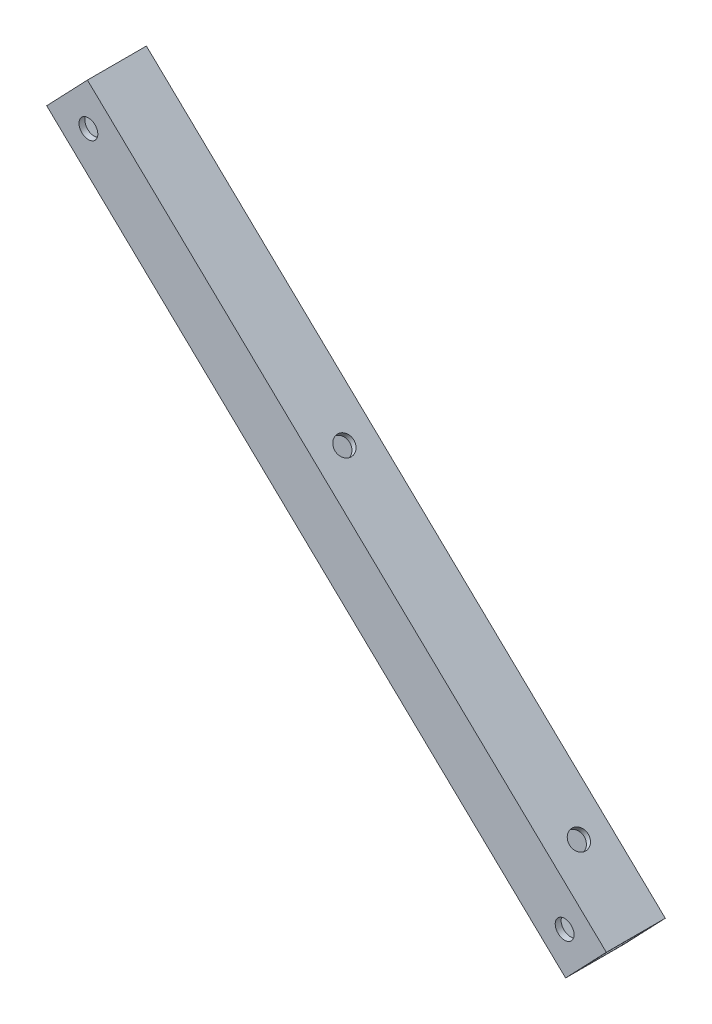
ISO-10303-21;
HEADER;
FILE_DESCRIPTION(('STEP AP214'),'2;1');
FILE_NAME('part.step','',(''),(''),'','','');
FILE_SCHEMA(('AUTOMOTIVE_DESIGN { 1 0 10303 214 1 1 1 1 }'));
ENDSEC;
DATA;
#1=APPLICATION_CONTEXT('core data for automotive mechanical design processes');
#2=APPLICATION_PROTOCOL_DEFINITION('international standard','automotive_design',2000,#1);
#3=PRODUCT_CONTEXT('',#1,'mechanical');
#4=PRODUCT('Part','Part','',(#3));
#5=PRODUCT_RELATED_PRODUCT_CATEGORY('part','',(#4));
#6=PRODUCT_DEFINITION_FORMATION('','',#4);
#7=PRODUCT_DEFINITION_CONTEXT('part definition',#1,'design');
#8=PRODUCT_DEFINITION('design','',#6,#7);
#9=PRODUCT_DEFINITION_SHAPE('','',#8);
#10=(LENGTH_UNIT() NAMED_UNIT(*) SI_UNIT(.MILLI.,.METRE.));
#11=(NAMED_UNIT(*) PLANE_ANGLE_UNIT() SI_UNIT($,.RADIAN.));
#12=(NAMED_UNIT(*) SI_UNIT($,.STERADIAN.) SOLID_ANGLE_UNIT());
#13=UNCERTAINTY_MEASURE_WITH_UNIT(LENGTH_MEASURE(1.E-05),#10,'distance_accuracy_value','');
#14=(GEOMETRIC_REPRESENTATION_CONTEXT(3) GLOBAL_UNCERTAINTY_ASSIGNED_CONTEXT((#13)) GLOBAL_UNIT_ASSIGNED_CONTEXT((#10,
#11,#12)) REPRESENTATION_CONTEXT('',''));
#15=CARTESIAN_POINT('',(0.,0.,0.));
#16=DIRECTION('',(0.,0.,1.));
#17=DIRECTION('',(1.,0.,0.));
#18=AXIS2_PLACEMENT_3D('',#15,#16,#17);
#19=CARTESIAN_POINT('',(-3.77609817293488,84.2848181798707,10.));
#20=DIRECTION('',(0.,0.,-1.));
#21=DIRECTION('',(-1.,0.,0.));
#22=AXIS2_PLACEMENT_3D('',#19,#20,#21);
#23=CYLINDRICAL_SURFACE('',#22,1.6);
#24=CARTESIAN_POINT('',(-3.77609817293488,84.2848181798707,9.));
#25=DIRECTION('',(0.,0.,1.));
#26=DIRECTION('',(1.,0.,0.));
#27=AXIS2_PLACEMENT_3D('',#24,#25,#26);
#28=CIRCLE('',#27,1.6);
#29=CARTESIAN_POINT('',(-2.17609817293488,84.2848181798707,9.));
#30=VERTEX_POINT('',#29);
#31=EDGE_CURVE('E136',#30,#30,#28,.T.);
#32=ORIENTED_EDGE('',*,*,#31,.F.);
#33=EDGE_LOOP('',(#32));
#34=FACE_BOUND('',#33,.T.);
#35=CARTESIAN_POINT('',(-3.77609817293488,84.2848181798707,10.));
#36=DIRECTION('',(0.,0.,1.));
#37=DIRECTION('',(1.,0.,0.));
#38=AXIS2_PLACEMENT_3D('',#35,#36,#37);
#39=CIRCLE('',#38,1.6);
#40=CARTESIAN_POINT('',(-2.17609817293488,84.2848181798707,10.));
#41=VERTEX_POINT('',#40);
#42=EDGE_CURVE('E146',#41,#41,#39,.T.);
#43=ORIENTED_EDGE('',*,*,#42,.T.);
#44=EDGE_LOOP('',(#43));
#45=FACE_BOUND('',#44,.T.);
#46=ADVANCED_FACE('F35',(#34,#45),#23,.F.);
#47=CARTESIAN_POINT('',(76.990408140841,7.09173909976924,10.));
#48=DIRECTION('',(0.,0.,-1.));
#49=DIRECTION('',(-1.,0.,0.));
#50=AXIS2_PLACEMENT_3D('',#47,#48,#49);
#51=CYLINDRICAL_SURFACE('',#50,1.60000000000001);
#52=CARTESIAN_POINT('',(76.990408140841,7.09173909976924,9.));
#53=DIRECTION('',(0.,0.,1.));
#54=DIRECTION('',(1.,0.,0.));
#55=AXIS2_PLACEMENT_3D('',#52,#53,#54);
#56=CIRCLE('',#55,1.60000000000001);
#57=CARTESIAN_POINT('',(78.590408140841,7.09173909976924,9.));
#58=VERTEX_POINT('',#57);
#59=EDGE_CURVE('E135',#58,#58,#56,.T.);
#60=ORIENTED_EDGE('',*,*,#59,.F.);
#61=EDGE_LOOP('',(#60));
#62=FACE_BOUND('',#61,.T.);
#63=CARTESIAN_POINT('',(76.990408140841,7.09173909976924,10.));
#64=DIRECTION('',(0.,0.,1.));
#65=DIRECTION('',(1.,0.,0.));
#66=AXIS2_PLACEMENT_3D('',#63,#64,#65);
#67=CIRCLE('',#66,1.60000000000001);
#68=CARTESIAN_POINT('',(78.590408140841,7.09173909976924,10.));
#69=VERTEX_POINT('',#68);
#70=EDGE_CURVE('E143',#69,#69,#67,.T.);
#71=ORIENTED_EDGE('',*,*,#70,.T.);
#72=EDGE_LOOP('',(#71));
#73=FACE_BOUND('',#72,.T.);
#74=ADVANCED_FACE('F235',(#62,#73),#51,.F.);
#75=CARTESIAN_POINT('',(40.3083714708663,-38.5249709137162,10.));
#76=DIRECTION('',(-0.722918282369836,0.690933540230496,0.));
#77=DIRECTION('',(-0.690933540230496,-0.722918282369836,0.));
#78=AXIS2_PLACEMENT_3D('',#75,#76,#77);
#79=PLANE('',#78);
#80=DIRECTION('',(0.,0.,-1.));
#81=VECTOR('',#80,1.);
#82=CARTESIAN_POINT('',(77.8412653917682,0.745398269137436,9.));
#83=LINE('',#82,#81);
#84=CARTESIAN_POINT('',(77.8412653917682,0.745398269137436,9.));
#85=VERTEX_POINT('',#84);
#86=CARTESIAN_POINT('',(77.8412653917682,0.745398269137436,1.));
#87=VERTEX_POINT('',#86);
#88=EDGE_CURVE('E114',#85,#87,#83,.T.);
#89=ORIENTED_EDGE('',*,*,#88,.F.);
#90=DIRECTION('',(-0.690933540230497,-0.722918282369835,0.));
#91=VECTOR('',#90,1.);
#92=CARTESIAN_POINT('',(77.8412653917682,0.745398269137436,9.));
#93=LINE('',#92,#91);
#94=CARTESIAN_POINT('',(83.3687337136122,6.52874452809612,9.));
#95=VERTEX_POINT('',#94);
#96=EDGE_CURVE('E52',#95,#85,#93,.T.);
#97=ORIENTED_EDGE('',*,*,#96,.F.);
#98=DIRECTION('',(0.,0.,1.));
#99=VECTOR('',#98,1.);
#100=CARTESIAN_POINT('',(83.3687337136122,6.52874452809612,9.));
#101=LINE('',#100,#99);
#102=CARTESIAN_POINT('',(83.3687337136122,6.52874452809612,1.));
#103=VERTEX_POINT('',#102);
#104=EDGE_CURVE('E121',#103,#95,#101,.T.);
#105=ORIENTED_EDGE('',*,*,#104,.F.);
#106=DIRECTION('',(0.690933540230497,0.722918282369835,0.));
#107=VECTOR('',#106,1.);
#108=CARTESIAN_POINT('',(77.8412653917682,0.745398269137436,1.));
#109=LINE('',#108,#107);
#110=EDGE_CURVE('E105',#87,#103,#109,.T.);
#111=ORIENTED_EDGE('',*,*,#110,.F.);
#112=EDGE_LOOP('',(#89,#97,#105,#111));
#113=FACE_BOUND('',#112,.T.);
#114=DIRECTION('',(0.690933540230496,0.722918282369836,0.));
#115=VECTOR('',#114,1.);
#116=CARTESIAN_POINT('',(40.3083714708663,-38.5249709137162,0.));
#117=LINE('',#116,#115);
#118=CARTESIAN_POINT('',(77.1503318515377,0.0224799867676109,0.));
#119=VERTEX_POINT('',#118);
#120=CARTESIAN_POINT('',(84.0596672538427,7.25166281046594,0.));
#121=VERTEX_POINT('',#120);
#122=EDGE_CURVE('E165',#119,#121,#117,.T.);
#123=ORIENTED_EDGE('',*,*,#122,.T.);
#124=DIRECTION('',(0.,0.,-1.));
#125=VECTOR('',#124,1.);
#126=CARTESIAN_POINT('',(84.0596672538427,7.25166281046594,10.));
#127=LINE('',#126,#125);
#128=CARTESIAN_POINT('',(84.0596672538427,7.25166281046594,10.));
#129=VERTEX_POINT('',#128);
#130=EDGE_CURVE('E181',#129,#121,#127,.T.);
#131=ORIENTED_EDGE('',*,*,#130,.F.);
#132=DIRECTION('',(0.690933540230496,0.722918282369836,0.));
#133=VECTOR('',#132,1.);
#134=CARTESIAN_POINT('',(40.3083714708663,-38.5249709137162,10.));
#135=LINE('',#134,#133);
#136=CARTESIAN_POINT('',(77.1503318515377,0.0224799867676109,10.));
#137=VERTEX_POINT('',#136);
#138=EDGE_CURVE('E150',#137,#129,#135,.T.);
#139=ORIENTED_EDGE('',*,*,#138,.F.);
#140=DIRECTION('',(0.,0.,-1.));
#141=VECTOR('',#140,1.);
#142=CARTESIAN_POINT('',(77.1503318515377,0.0224799867676109,10.));
#143=LINE('',#142,#141);
#144=EDGE_CURVE('E159',#137,#119,#143,.T.);
#145=ORIENTED_EDGE('',*,*,#144,.T.);
#146=EDGE_LOOP('',(#123,#131,#139,#145));
#147=FACE_BOUND('',#146,.T.);
#148=ADVANCED_FACE('F118',(#113,#147),#79,.F.);
#149=CARTESIAN_POINT('',(43.7512957829762,45.7766337241822,10.));
#150=DIRECTION('',(-0.690933540230495,-0.722918282369837,0.));
#151=DIRECTION('',(0.722918282369837,-0.690933540230495,0.));
#152=AXIS2_PLACEMENT_3D('',#149,#150,#151);
#153=PLANE('',#152);
#154=CARTESIAN_POINT('',(34.6399355673318,54.4848716033979,5.));
#155=DIRECTION('',(-0.690933540230496,-0.722918282369836,0.));
#156=DIRECTION('',(0.722918282369836,-0.690933540230496,0.));
#157=AXIS2_PLACEMENT_3D('',#154,#155,#156);
#158=CIRCLE('',#157,1.6);
#159=CARTESIAN_POINT('',(35.7966048191236,53.3793779390291,5.));
#160=VERTEX_POINT('',#159);
#161=EDGE_CURVE('E191',#160,#160,#158,.T.);
#162=ORIENTED_EDGE('',*,*,#161,.T.);
#163=EDGE_LOOP('',(#162));
#164=FACE_BOUND('',#163,.T.);
#165=CARTESIAN_POINT('',(74.4004410976728,16.4835268907207,5.));
#166=DIRECTION('',(-0.690933540230496,-0.722918282369836,0.));
#167=DIRECTION('',(0.722918282369836,-0.690933540230496,0.));
#168=AXIS2_PLACEMENT_3D('',#165,#166,#167);
#169=CIRCLE('',#168,1.6);
#170=CARTESIAN_POINT('',(75.5571103494645,15.3780332263519,5.));
#171=VERTEX_POINT('',#170);
#172=EDGE_CURVE('E202',#171,#171,#169,.T.);
#173=ORIENTED_EDGE('',*,*,#172,.T.);
#174=EDGE_LOOP('',(#173));
#175=FACE_BOUND('',#174,.T.);
#176=DIRECTION('',(-0.722918282369837,0.690933540230495,0.));
#177=VECTOR('',#176,1.);
#178=CARTESIAN_POINT('',(43.7512957829762,45.7766337241822,0.));
#179=LINE('',#178,#177);
#180=CARTESIAN_POINT('',(-3.93602188363157,91.3540772928723,0.));
#181=VERTEX_POINT('',#180);
#182=EDGE_CURVE('E168',#121,#181,#179,.T.);
#183=ORIENTED_EDGE('',*,*,#182,.T.);
#184=DIRECTION('',(0.,0.,-1.));
#185=VECTOR('',#184,1.);
#186=CARTESIAN_POINT('',(-3.93602188363157,91.3540772928723,10.));
#187=LINE('',#186,#185);
#188=CARTESIAN_POINT('',(-3.93602188363157,91.3540772928723,10.));
#189=VERTEX_POINT('',#188);
#190=EDGE_CURVE('E178',#189,#181,#187,.T.);
#191=ORIENTED_EDGE('',*,*,#190,.F.);
#192=DIRECTION('',(-0.722918282369837,0.690933540230495,0.));
#193=VECTOR('',#192,1.);
#194=CARTESIAN_POINT('',(43.7512957829762,45.7766337241822,10.));
#195=LINE('',#194,#193);
#196=EDGE_CURVE('E153',#129,#189,#195,.T.);
#197=ORIENTED_EDGE('',*,*,#196,.F.);
#198=ORIENTED_EDGE('',*,*,#130,.T.);
#199=EDGE_LOOP('',(#183,#191,#197,#198));
#200=FACE_BOUND('',#199,.T.);
#201=ADVANCED_FACE('F254',(#164,#175,#200),#153,.F.);
#202=CARTESIAN_POINT('',(-47.6873176666079,45.5774435686902,10.));
#203=DIRECTION('',(0.722918282369836,-0.690933540230496,0.));
#204=DIRECTION('',(0.690933540230496,0.722918282369836,0.));
#205=AXIS2_PLACEMENT_3D('',#202,#203,#204);
#206=PLANE('',#205);
#207=DIRECTION('',(0.,0.,1.));
#208=VECTOR('',#207,1.);
#209=CARTESIAN_POINT('',(-4.626955423862,90.6311590105026,10.));
#210=LINE('',#209,#208);
#211=CARTESIAN_POINT('',(-4.626955423862,90.6311590105026,1.));
#212=VERTEX_POINT('',#211);
#213=CARTESIAN_POINT('',(-4.626955423862,90.6311590105026,9.));
#214=VERTEX_POINT('',#213);
#215=EDGE_CURVE('E11',#212,#214,#210,.T.);
#216=ORIENTED_EDGE('',*,*,#215,.T.);
#217=DIRECTION('',(-0.690933540230496,-0.722918282369836,0.));
#218=VECTOR('',#217,1.);
#219=CARTESIAN_POINT('',(-47.6873176666079,45.5774435686902,9.));
#220=LINE('',#219,#218);
#221=CARTESIAN_POINT('',(-10.154423745706,84.8478127515439,9.));
#222=VERTEX_POINT('',#221);
#223=EDGE_CURVE('E139',#214,#222,#220,.T.);
#224=ORIENTED_EDGE('',*,*,#223,.T.);
#225=DIRECTION('',(0.,0.,-1.));
#226=VECTOR('',#225,1.);
#227=CARTESIAN_POINT('',(-10.154423745706,84.8478127515439,10.));
#228=LINE('',#227,#226);
#229=CARTESIAN_POINT('',(-10.154423745706,84.8478127515439,1.));
#230=VERTEX_POINT('',#229);
#231=EDGE_CURVE('E44',#222,#230,#228,.T.);
#232=ORIENTED_EDGE('',*,*,#231,.T.);
#233=DIRECTION('',(0.690933540230496,0.722918282369836,0.));
#234=VECTOR('',#233,1.);
#235=CARTESIAN_POINT('',(-47.6873176666079,45.5774435686902,1.));
#236=LINE('',#235,#234);
#237=EDGE_CURVE('E108',#230,#212,#236,.T.);
#238=ORIENTED_EDGE('',*,*,#237,.T.);
#239=EDGE_LOOP('',(#216,#224,#232,#238));
#240=FACE_BOUND('',#239,.T.);
#241=DIRECTION('',(-0.690933540230496,-0.722918282369836,0.));
#242=VECTOR('',#241,1.);
#243=CARTESIAN_POINT('',(-47.6873176666079,45.5774435686902,0.));
#244=LINE('',#243,#242);
#245=CARTESIAN_POINT('',(-10.8453572859366,84.124894469174,0.));
#246=VERTEX_POINT('',#245);
#247=EDGE_CURVE('E170',#181,#246,#244,.T.);
#248=ORIENTED_EDGE('',*,*,#247,.T.);
#249=DIRECTION('',(0.,0.,-1.));
#250=VECTOR('',#249,1.);
#251=CARTESIAN_POINT('',(-10.8453572859366,84.124894469174,10.));
#252=LINE('',#251,#250);
#253=CARTESIAN_POINT('',(-10.8453572859366,84.124894469174,10.));
#254=VERTEX_POINT('',#253);
#255=EDGE_CURVE('E175',#254,#246,#252,.T.);
#256=ORIENTED_EDGE('',*,*,#255,.F.);
#257=DIRECTION('',(-0.690933540230496,-0.722918282369836,0.));
#258=VECTOR('',#257,1.);
#259=CARTESIAN_POINT('',(-47.6873176666079,45.5774435686902,10.));
#260=LINE('',#259,#258);
#261=EDGE_CURVE('E155',#189,#254,#260,.T.);
#262=ORIENTED_EDGE('',*,*,#261,.F.);
#263=ORIENTED_EDGE('',*,*,#190,.T.);
#264=EDGE_LOOP('',(#248,#256,#262,#263));
#265=FACE_BOUND('',#264,.T.);
#266=ADVANCED_FACE('F246',(#240,#265),#206,.F.);
#267=CARTESIAN_POINT('',(-3.77609817293488,84.2848181798707,1.));
#268=DIRECTION('',(0.,0.,-1.));
#269=DIRECTION('',(-1.,0.,0.));
#270=AXIS2_PLACEMENT_3D('',#267,#268,#269);
#271=CIRCLE('',#270,1.6);
#272=CARTESIAN_POINT('',(-5.37609817293488,84.2848181798707,1.));
#273=VERTEX_POINT('',#272);
#274=EDGE_CURVE('E131',#273,#273,#271,.T.);
#275=ORIENTED_EDGE('',*,*,#274,.F.);
#276=EDGE_LOOP('',(#275));
#277=FACE_BOUND('',#276,.T.);
#278=CARTESIAN_POINT('',(-3.77609817293488,84.2848181798707,0.));
#279=DIRECTION('',(0.,0.,1.));
#280=DIRECTION('',(1.,0.,0.));
#281=AXIS2_PLACEMENT_3D('',#278,#279,#280);
#282=CIRCLE('',#281,1.6);
#283=CARTESIAN_POINT('',(-2.17609817293488,84.2848181798707,0.));
#284=VERTEX_POINT('',#283);
#285=EDGE_CURVE('E162',#284,#284,#282,.T.);
#286=ORIENTED_EDGE('',*,*,#285,.F.);
#287=EDGE_LOOP('',(#286));
#288=FACE_BOUND('',#287,.T.);
#289=ADVANCED_FACE('F237',(#277,#288),#23,.F.);
#290=CARTESIAN_POINT('',(76.990408140841,7.09173909976924,1.));
#291=DIRECTION('',(0.,0.,-1.));
#292=DIRECTION('',(-1.,0.,0.));
#293=AXIS2_PLACEMENT_3D('',#290,#291,#292);
#294=CIRCLE('',#293,1.60000000000001);
#295=CARTESIAN_POINT('',(75.390408140841,7.09173909976924,1.));
#296=VERTEX_POINT('',#295);
#297=EDGE_CURVE('E128',#296,#296,#294,.T.);
#298=ORIENTED_EDGE('',*,*,#297,.F.);
#299=EDGE_LOOP('',(#298));
#300=FACE_BOUND('',#299,.T.);
#301=CARTESIAN_POINT('',(76.990408140841,7.09173909976924,0.));
#302=DIRECTION('',(0.,0.,1.));
#303=DIRECTION('',(1.,0.,0.));
#304=AXIS2_PLACEMENT_3D('',#301,#302,#303);
#305=CIRCLE('',#304,1.60000000000001);
#306=CARTESIAN_POINT('',(78.590408140841,7.09173909976924,0.));
#307=VERTEX_POINT('',#306);
#308=EDGE_CURVE('E142',#307,#307,#305,.T.);
#309=ORIENTED_EDGE('',*,*,#308,.F.);
#310=EDGE_LOOP('',(#309));
#311=FACE_BOUND('',#310,.T.);
#312=ADVANCED_FACE('F37',(#300,#311),#51,.F.);
#313=CARTESIAN_POINT('',(36.8419603806713,38.5474509004838,10.));
#314=DIRECTION('',(0.690933540230495,0.722918282369836,0.));
#315=DIRECTION('',(-0.722918282369836,0.690933540230495,0.));
#316=AXIS2_PLACEMENT_3D('',#313,#314,#315);
#317=PLANE('',#316);
#318=CARTESIAN_POINT('',(27.7306001650269,47.2556887796995,5.));
#319=DIRECTION('',(-0.690933540230496,-0.722918282369836,0.));
#320=DIRECTION('',(0.722918282369836,-0.690933540230496,0.));
#321=AXIS2_PLACEMENT_3D('',#318,#319,#320);
#322=CIRCLE('',#321,1.6);
#323=CARTESIAN_POINT('',(28.8872694168186,46.1501951153308,5.));
#324=VERTEX_POINT('',#323);
#325=EDGE_CURVE('E197',#324,#324,#322,.T.);
#326=ORIENTED_EDGE('',*,*,#325,.F.);
#327=EDGE_LOOP('',(#326));
#328=FACE_BOUND('',#327,.T.);
#329=CARTESIAN_POINT('',(67.4911056953678,9.25434406702229,5.));
#330=DIRECTION('',(-0.690933540230496,-0.722918282369836,0.));
#331=DIRECTION('',(0.722918282369836,-0.690933540230496,0.));
#332=AXIS2_PLACEMENT_3D('',#329,#330,#331);
#333=CIRCLE('',#332,1.6);
#334=CARTESIAN_POINT('',(68.6477749471596,8.14885040265349,5.));
#335=VERTEX_POINT('',#334);
#336=EDGE_CURVE('E207',#335,#335,#333,.T.);
#337=ORIENTED_EDGE('',*,*,#336,.F.);
#338=EDGE_LOOP('',(#337));
#339=FACE_BOUND('',#338,.T.);
#340=DIRECTION('',(0.722918282369836,-0.690933540230495,0.));
#341=VECTOR('',#340,1.);
#342=CARTESIAN_POINT('',(36.8419603806713,38.5474509004838,0.));
#343=LINE('',#342,#341);
#344=EDGE_CURVE('E147',#246,#119,#343,.T.);
#345=ORIENTED_EDGE('',*,*,#344,.T.);
#346=ORIENTED_EDGE('',*,*,#144,.F.);
#347=DIRECTION('',(0.722918282369836,-0.690933540230495,0.));
#348=VECTOR('',#347,1.);
#349=CARTESIAN_POINT('',(36.8419603806713,38.5474509004838,10.));
#350=LINE('',#349,#348);
#351=EDGE_CURVE('E157',#254,#137,#350,.T.);
#352=ORIENTED_EDGE('',*,*,#351,.F.);
#353=ORIENTED_EDGE('',*,*,#255,.T.);
#354=EDGE_LOOP('',(#345,#346,#352,#353));
#355=FACE_BOUND('',#354,.T.);
#356=ADVANCED_FACE('F252',(#328,#339,#355),#317,.F.);
#357=CARTESIAN_POINT('',(0.,0.,10.));
#358=DIRECTION('',(0.,0.,1.));
#359=DIRECTION('',(1.,0.,0.));
#360=AXIS2_PLACEMENT_3D('',#357,#358,#359);
#361=PLANE('',#360);
#362=ORIENTED_EDGE('',*,*,#70,.F.);
#363=EDGE_LOOP('',(#362));
#364=FACE_BOUND('',#363,.T.);
#365=ORIENTED_EDGE('',*,*,#42,.F.);
#366=EDGE_LOOP('',(#365));
#367=FACE_BOUND('',#366,.T.);
#368=ORIENTED_EDGE('',*,*,#138,.T.);
#369=ORIENTED_EDGE('',*,*,#196,.T.);
#370=ORIENTED_EDGE('',*,*,#261,.T.);
#371=ORIENTED_EDGE('',*,*,#351,.T.);
#372=EDGE_LOOP('',(#368,#369,#370,#371));
#373=FACE_BOUND('',#372,.T.);
#374=ADVANCED_FACE('F265',(#364,#367,#373),#361,.T.);
#375=CARTESIAN_POINT('',(0.,0.,0.));
#376=DIRECTION('',(0.,0.,1.));
#377=DIRECTION('',(1.,0.,0.));
#378=AXIS2_PLACEMENT_3D('',#375,#376,#377);
#379=PLANE('',#378);
#380=ORIENTED_EDGE('',*,*,#308,.T.);
#381=EDGE_LOOP('',(#380));
#382=FACE_BOUND('',#381,.T.);
#383=ORIENTED_EDGE('',*,*,#285,.T.);
#384=EDGE_LOOP('',(#383));
#385=FACE_BOUND('',#384,.T.);
#386=ORIENTED_EDGE('',*,*,#122,.F.);
#387=ORIENTED_EDGE('',*,*,#344,.F.);
#388=ORIENTED_EDGE('',*,*,#247,.F.);
#389=ORIENTED_EDGE('',*,*,#182,.F.);
#390=EDGE_LOOP('',(#386,#387,#388,#389));
#391=FACE_BOUND('',#390,.T.);
#392=ADVANCED_FACE('F261',(#382,#385,#391),#379,.F.);
#393=CARTESIAN_POINT('',(-8.23784902292359,94.0822925046184,9.));
#394=DIRECTION('',(0.690933540230496,0.722918282369836,0.));
#395=DIRECTION('',(-0.722918282369836,0.690933540230496,0.));
#396=AXIS2_PLACEMENT_3D('',#393,#394,#395);
#397=PLANE('',#396);
#398=CARTESIAN_POINT('',(33.9490020271013,53.7619533210281,5.));
#399=DIRECTION('',(0.690933540230496,0.722918282369836,0.));
#400=DIRECTION('',(-0.722918282369836,0.690933540230496,0.));
#401=AXIS2_PLACEMENT_3D('',#398,#399,#400);
#402=CIRCLE('',#401,1.6);
#403=CARTESIAN_POINT('',(32.7923327753096,54.8674469853969,5.));
#404=VERTEX_POINT('',#403);
#405=EDGE_CURVE('E210',#404,#404,#402,.T.);
#406=ORIENTED_EDGE('',*,*,#405,.T.);
#407=EDGE_LOOP('',(#406));
#408=FACE_BOUND('',#407,.T.);
#409=CARTESIAN_POINT('',(73.7095075574423,15.7606086083508,5.));
#410=DIRECTION('',(0.690933540230496,0.722918282369836,0.));
#411=DIRECTION('',(-0.722918282369836,0.690933540230496,0.));
#412=AXIS2_PLACEMENT_3D('',#409,#410,#411);
#413=CIRCLE('',#412,1.6);
#414=CARTESIAN_POINT('',(72.5528383056506,16.8661022727196,5.));
#415=VERTEX_POINT('',#414);
#416=EDGE_CURVE('E190',#415,#415,#413,.T.);
#417=ORIENTED_EDGE('',*,*,#416,.T.);
#418=EDGE_LOOP('',(#417));
#419=FACE_BOUND('',#418,.T.);
#420=DIRECTION('',(0.722918282369836,-0.690933540230496,0.));
#421=VECTOR('',#420,1.);
#422=CARTESIAN_POINT('',(-8.23784902292359,94.0822925046184,1.));
#423=LINE('',#422,#421);
#424=EDGE_CURVE('E110',#212,#103,#423,.T.);
#425=ORIENTED_EDGE('',*,*,#424,.T.);
#426=ORIENTED_EDGE('',*,*,#104,.T.);
#427=DIRECTION('',(0.722918282369836,-0.690933540230496,0.));
#428=VECTOR('',#427,1.);
#429=CARTESIAN_POINT('',(-8.23784902292359,94.0822925046184,9.));
#430=LINE('',#429,#428);
#431=EDGE_CURVE('E126',#214,#95,#430,.T.);
#432=ORIENTED_EDGE('',*,*,#431,.F.);
#433=ORIENTED_EDGE('',*,*,#215,.F.);
#434=EDGE_LOOP('',(#425,#426,#432,#433));
#435=FACE_BOUND('',#434,.T.);
#436=ADVANCED_FACE('F264',(#408,#419,#435),#397,.F.);
#437=CARTESIAN_POINT('',(-13.7653173447676,88.2989462456598,9.));
#438=DIRECTION('',(-0.690933540230496,-0.722918282369836,0.));
#439=DIRECTION('',(0.722918282369836,-0.690933540230496,0.));
#440=AXIS2_PLACEMENT_3D('',#437,#438,#439);
#441=PLANE('',#440);
#442=CARTESIAN_POINT('',(28.4215337052574,47.9786070620694,5.));
#443=DIRECTION('',(-0.690933540230496,-0.722918282369836,0.));
#444=DIRECTION('',(0.722918282369836,-0.690933540230496,0.));
#445=AXIS2_PLACEMENT_3D('',#442,#443,#444);
#446=CIRCLE('',#445,1.6);
#447=CARTESIAN_POINT('',(29.5782029570491,46.8731133977006,5.));
#448=VERTEX_POINT('',#447);
#449=EDGE_CURVE('E39',#448,#448,#446,.T.);
#450=ORIENTED_EDGE('',*,*,#449,.T.);
#451=EDGE_LOOP('',(#450));
#452=FACE_BOUND('',#451,.T.);
#453=CARTESIAN_POINT('',(68.1820392355983,9.97726234939211,5.));
#454=DIRECTION('',(-0.690933540230496,-0.722918282369836,0.));
#455=DIRECTION('',(0.722918282369836,-0.690933540230496,0.));
#456=AXIS2_PLACEMENT_3D('',#453,#454,#455);
#457=CIRCLE('',#456,1.6);
#458=CARTESIAN_POINT('',(69.3387084873901,8.87176868502332,5.));
#459=VERTEX_POINT('',#458);
#460=EDGE_CURVE('E188',#459,#459,#457,.T.);
#461=ORIENTED_EDGE('',*,*,#460,.T.);
#462=EDGE_LOOP('',(#461));
#463=FACE_BOUND('',#462,.T.);
#464=DIRECTION('',(0.722918282369836,-0.690933540230496,0.));
#465=VECTOR('',#464,1.);
#466=CARTESIAN_POINT('',(-13.7653173447676,88.2989462456598,9.));
#467=LINE('',#466,#465);
#468=EDGE_CURVE('E111',#222,#85,#467,.T.);
#469=ORIENTED_EDGE('',*,*,#468,.T.);
#470=ORIENTED_EDGE('',*,*,#88,.T.);
#471=DIRECTION('',(0.722918282369836,-0.690933540230496,0.));
#472=VECTOR('',#471,1.);
#473=CARTESIAN_POINT('',(-13.7653173447676,88.2989462456598,1.));
#474=LINE('',#473,#472);
#475=EDGE_CURVE('E60',#230,#87,#474,.T.);
#476=ORIENTED_EDGE('',*,*,#475,.F.);
#477=ORIENTED_EDGE('',*,*,#231,.F.);
#478=EDGE_LOOP('',(#469,#470,#476,#477));
#479=FACE_BOUND('',#478,.T.);
#480=ADVANCED_FACE('F115',(#452,#463,#479),#441,.F.);
#481=CARTESIAN_POINT('',(-13.7653173447676,88.2989462456598,9.));
#482=DIRECTION('',(0.,0.,1.));
#483=DIRECTION('',(1.,0.,0.));
#484=AXIS2_PLACEMENT_3D('',#481,#482,#483);
#485=PLANE('',#484);
#486=ORIENTED_EDGE('',*,*,#31,.T.);
#487=EDGE_LOOP('',(#486));
#488=FACE_BOUND('',#487,.T.);
#489=ORIENTED_EDGE('',*,*,#59,.T.);
#490=EDGE_LOOP('',(#489));
#491=FACE_BOUND('',#490,.T.);
#492=ORIENTED_EDGE('',*,*,#431,.T.);
#493=ORIENTED_EDGE('',*,*,#96,.T.);
#494=ORIENTED_EDGE('',*,*,#468,.F.);
#495=ORIENTED_EDGE('',*,*,#223,.F.);
#496=EDGE_LOOP('',(#492,#493,#494,#495));
#497=FACE_BOUND('',#496,.T.);
#498=ADVANCED_FACE('F293',(#488,#491,#497),#485,.F.);
#499=CARTESIAN_POINT('',(-13.7653173447676,88.2989462456598,1.));
#500=DIRECTION('',(0.,0.,-1.));
#501=DIRECTION('',(-1.,0.,0.));
#502=AXIS2_PLACEMENT_3D('',#499,#500,#501);
#503=PLANE('',#502);
#504=ORIENTED_EDGE('',*,*,#274,.T.);
#505=EDGE_LOOP('',(#504));
#506=FACE_BOUND('',#505,.T.);
#507=ORIENTED_EDGE('',*,*,#297,.T.);
#508=EDGE_LOOP('',(#507));
#509=FACE_BOUND('',#508,.T.);
#510=ORIENTED_EDGE('',*,*,#475,.T.);
#511=ORIENTED_EDGE('',*,*,#110,.T.);
#512=ORIENTED_EDGE('',*,*,#424,.F.);
#513=ORIENTED_EDGE('',*,*,#237,.F.);
#514=EDGE_LOOP('',(#510,#511,#512,#513));
#515=FACE_BOUND('',#514,.T.);
#516=ADVANCED_FACE('F102',(#506,#509,#515),#503,.F.);
#517=CARTESIAN_POINT('',(74.4004410976728,16.4835268907207,5.));
#518=DIRECTION('',(-0.690933540230496,-0.722918282369836,0.));
#519=DIRECTION('',(0.722918282369836,-0.690933540230496,0.));
#520=AXIS2_PLACEMENT_3D('',#517,#518,#519);
#521=CYLINDRICAL_SURFACE('',#520,1.6);
#522=ORIENTED_EDGE('',*,*,#336,.T.);
#523=EDGE_LOOP('',(#522));
#524=FACE_BOUND('',#523,.T.);
#525=ORIENTED_EDGE('',*,*,#460,.F.);
#526=EDGE_LOOP('',(#525));
#527=FACE_BOUND('',#526,.T.);
#528=ADVANCED_FACE('F221',(#524,#527),#521,.F.);
#529=CARTESIAN_POINT('',(34.6399355673318,54.4848716033979,5.));
#530=DIRECTION('',(-0.690933540230496,-0.722918282369836,0.));
#531=DIRECTION('',(0.722918282369836,-0.690933540230496,0.));
#532=AXIS2_PLACEMENT_3D('',#529,#530,#531);
#533=CYLINDRICAL_SURFACE('',#532,1.6);
#534=ORIENTED_EDGE('',*,*,#325,.T.);
#535=EDGE_LOOP('',(#534));
#536=FACE_BOUND('',#535,.T.);
#537=ORIENTED_EDGE('',*,*,#449,.F.);
#538=EDGE_LOOP('',(#537));
#539=FACE_BOUND('',#538,.T.);
#540=ADVANCED_FACE('F218',(#536,#539),#533,.F.);
#541=ORIENTED_EDGE('',*,*,#172,.F.);
#542=EDGE_LOOP('',(#541));
#543=FACE_BOUND('',#542,.T.);
#544=ORIENTED_EDGE('',*,*,#416,.F.);
#545=EDGE_LOOP('',(#544));
#546=FACE_BOUND('',#545,.T.);
#547=ADVANCED_FACE('F220',(#543,#546),#521,.F.);
#548=ORIENTED_EDGE('',*,*,#161,.F.);
#549=EDGE_LOOP('',(#548));
#550=FACE_BOUND('',#549,.T.);
#551=ORIENTED_EDGE('',*,*,#405,.F.);
#552=EDGE_LOOP('',(#551));
#553=FACE_BOUND('',#552,.T.);
#554=ADVANCED_FACE('F224',(#550,#553),#533,.F.);
#555=CLOSED_SHELL('',(#46,#74,#148,#201,#266,#289,#312,#356,#374,#392,#436,#480,#498,#516,#528,
#540,#547,#554));
#556=MANIFOLD_SOLID_BREP('B2',#555);
#557=ADVANCED_BREP_SHAPE_REPRESENTATION('',(#18,#556),#14);
#558=SHAPE_DEFINITION_REPRESENTATION(#9,#557);
ENDSEC;
END-ISO-10303-21;
